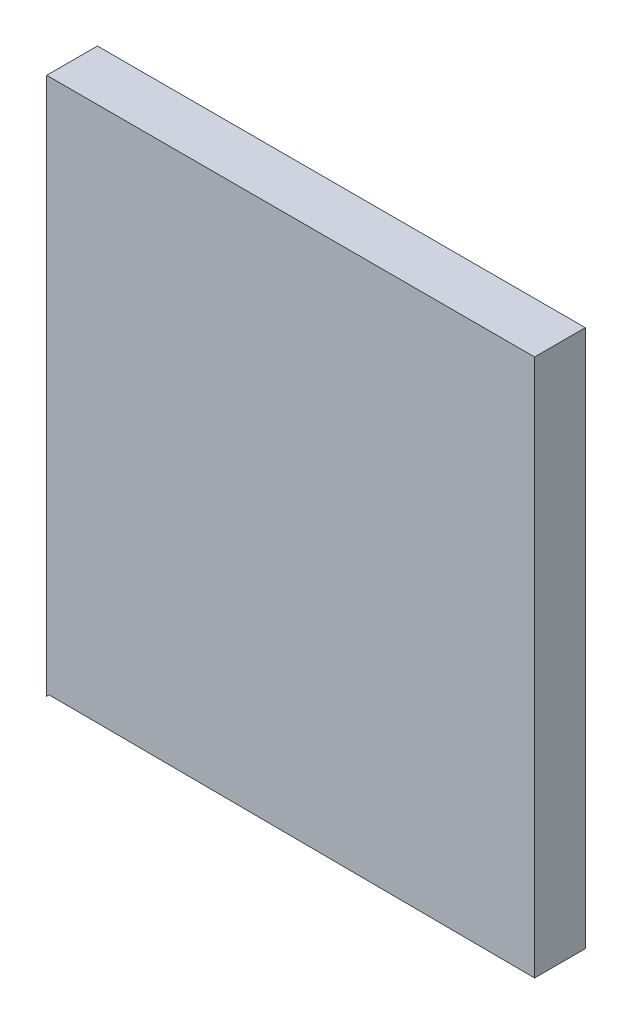
ISO-10303-21;
HEADER;
FILE_DESCRIPTION(('STEP AP214'),'2;1');
FILE_NAME('part.step','',(''),(''),'','','');
FILE_SCHEMA(('AUTOMOTIVE_DESIGN { 1 0 10303 214 1 1 1 1 }'));
ENDSEC;
DATA;
#1=APPLICATION_CONTEXT('core data for automotive mechanical design processes');
#2=APPLICATION_PROTOCOL_DEFINITION('international standard','automotive_design',2000,#1);
#3=PRODUCT_CONTEXT('',#1,'mechanical');
#4=PRODUCT('Part','Part','',(#3));
#5=PRODUCT_RELATED_PRODUCT_CATEGORY('part','',(#4));
#6=PRODUCT_DEFINITION_FORMATION('','',#4);
#7=PRODUCT_DEFINITION_CONTEXT('part definition',#1,'design');
#8=PRODUCT_DEFINITION('design','',#6,#7);
#9=PRODUCT_DEFINITION_SHAPE('','',#8);
#10=(LENGTH_UNIT() NAMED_UNIT(*) SI_UNIT(.MILLI.,.METRE.));
#11=(NAMED_UNIT(*) PLANE_ANGLE_UNIT() SI_UNIT($,.RADIAN.));
#12=(NAMED_UNIT(*) SI_UNIT($,.STERADIAN.) SOLID_ANGLE_UNIT());
#13=UNCERTAINTY_MEASURE_WITH_UNIT(LENGTH_MEASURE(1.E-05),#10,'distance_accuracy_value','');
#14=(GEOMETRIC_REPRESENTATION_CONTEXT(3) GLOBAL_UNCERTAINTY_ASSIGNED_CONTEXT((#13)) GLOBAL_UNIT_ASSIGNED_CONTEXT((#10,
#11,#12)) REPRESENTATION_CONTEXT('',''));
#15=CARTESIAN_POINT('',(0.,0.,0.));
#16=DIRECTION('',(0.,0.,1.));
#17=DIRECTION('',(1.,0.,0.));
#18=AXIS2_PLACEMENT_3D('',#15,#16,#17);
#19=CARTESIAN_POINT('',(12.5000004,0.88900254,0.1999996));
#20=DIRECTION('',(0.,-1.,0.));
#21=DIRECTION('',(-1.,0.,0.));
#22=AXIS2_PLACEMENT_3D('',#19,#20,#21);
#23=PLANE('',#22);
#24=DIRECTION('',(-1.,0.,0.));
#25=VECTOR('',#24,1.);
#26=CARTESIAN_POINT('',(12.5000004,0.88900254,0.1999996));
#27=LINE('',#26,#25);
#28=CARTESIAN_POINT('',(12.5000004,0.88900254,0.1999996));
#29=VERTEX_POINT('',#28);
#30=CARTESIAN_POINT('',(0.,0.88900254,0.1999996));
#31=VERTEX_POINT('',#30);
#32=EDGE_CURVE('E10',#29,#31,#27,.T.);
#33=ORIENTED_EDGE('',*,*,#32,.T.);
#34=DIRECTION('',(0.,0.,1.));
#35=VECTOR('',#34,1.);
#36=CARTESIAN_POINT('',(0.,0.88900254,0.1999996));
#37=LINE('',#36,#35);
#38=CARTESIAN_POINT('',(0.,0.88900254,1.49999954));
#39=VERTEX_POINT('',#38);
#40=EDGE_CURVE('E23',#31,#39,#37,.T.);
#41=ORIENTED_EDGE('',*,*,#40,.T.);
#42=DIRECTION('',(-1.,0.,0.));
#43=VECTOR('',#42,1.);
#44=CARTESIAN_POINT('',(12.5000004,0.88900254,1.49999954));
#45=LINE('',#44,#43);
#46=CARTESIAN_POINT('',(12.5000004,0.88900254,1.49999954));
#47=VERTEX_POINT('',#46);
#48=EDGE_CURVE('E99',#47,#39,#45,.T.);
#49=ORIENTED_EDGE('',*,*,#48,.F.);
#50=DIRECTION('',(0.,0.,1.));
#51=VECTOR('',#50,1.);
#52=CARTESIAN_POINT('',(12.5000004,0.88900254,0.1999996));
#53=LINE('',#52,#51);
#54=EDGE_CURVE('E36',#29,#47,#53,.T.);
#55=ORIENTED_EDGE('',*,*,#54,.F.);
#56=EDGE_LOOP('',(#33,#41,#49,#55));
#57=FACE_BOUND('',#56,.T.);
#58=ADVANCED_FACE('F16',(#57),#23,.F.);
#59=CARTESIAN_POINT('',(0.,0.88900254,0.1999996));
#60=DIRECTION('',(1.,0.,0.));
#61=DIRECTION('',(0.,-1.,0.));
#62=AXIS2_PLACEMENT_3D('',#59,#60,#61);
#63=PLANE('',#62);
#64=DIRECTION('',(0.,-1.,0.));
#65=VECTOR('',#64,1.);
#66=CARTESIAN_POINT('',(0.,0.88900254,0.1999996));
#67=LINE('',#66,#65);
#68=CARTESIAN_POINT('',(0.,-12.89099784,0.1999996));
#69=VERTEX_POINT('',#68);
#70=EDGE_CURVE('E30',#31,#69,#67,.T.);
#71=ORIENTED_EDGE('',*,*,#70,.T.);
#72=DIRECTION('',(0.,0.,1.));
#73=VECTOR('',#72,1.);
#74=CARTESIAN_POINT('',(0.,-12.89099784,0.1999996));
#75=LINE('',#74,#73);
#76=CARTESIAN_POINT('',(0.,-12.89099784,1.49999954));
#77=VERTEX_POINT('',#76);
#78=EDGE_CURVE('E95',#69,#77,#75,.T.);
#79=ORIENTED_EDGE('',*,*,#78,.T.);
#80=DIRECTION('',(0.,-1.,0.));
#81=VECTOR('',#80,1.);
#82=CARTESIAN_POINT('',(0.,0.88900254,1.49999954));
#83=LINE('',#82,#81);
#84=EDGE_CURVE('E93',#39,#77,#83,.T.);
#85=ORIENTED_EDGE('',*,*,#84,.F.);
#86=ORIENTED_EDGE('',*,*,#40,.F.);
#87=EDGE_LOOP('',(#71,#79,#85,#86));
#88=FACE_BOUND('',#87,.T.);
#89=ADVANCED_FACE('F104',(#88),#63,.F.);
#90=CARTESIAN_POINT('',(0.,-12.89099784,0.1999996));
#91=DIRECTION('',(-0.707106781186548,0.707106781186548,0.));
#92=DIRECTION('',(0.707106781186548,0.707106781186548,0.));
#93=AXIS2_PLACEMENT_3D('',#90,#91,#92);
#94=PLANE('',#93);
#95=DIRECTION('',(0.707106781186548,0.707106781186548,0.));
#96=VECTOR('',#95,1.);
#97=CARTESIAN_POINT('',(0.,-12.89099784,0.1999996));
#98=LINE('',#97,#96);
#99=CARTESIAN_POINT('',(0.0640003799999995,-12.82699746,0.1999996));
#100=VERTEX_POINT('',#99);
#101=EDGE_CURVE('E91',#69,#100,#98,.T.);
#102=ORIENTED_EDGE('',*,*,#101,.T.);
#103=DIRECTION('',(0.,0.,1.));
#104=VECTOR('',#103,1.);
#105=CARTESIAN_POINT('',(0.0640003799999995,-12.82699746,0.1999996));
#106=LINE('',#105,#104);
#107=CARTESIAN_POINT('',(0.0640003799999995,-12.82699746,1.49999954));
#108=VERTEX_POINT('',#107);
#109=EDGE_CURVE('E89',#100,#108,#106,.T.);
#110=ORIENTED_EDGE('',*,*,#109,.T.);
#111=DIRECTION('',(0.707106781186548,0.707106781186548,0.));
#112=VECTOR('',#111,1.);
#113=CARTESIAN_POINT('',(0.,-12.89099784,1.49999954));
#114=LINE('',#113,#112);
#115=EDGE_CURVE('E68',#77,#108,#114,.T.);
#116=ORIENTED_EDGE('',*,*,#115,.F.);
#117=ORIENTED_EDGE('',*,*,#78,.F.);
#118=EDGE_LOOP('',(#102,#110,#116,#117));
#119=FACE_BOUND('',#118,.T.);
#120=ADVANCED_FACE('F107',(#119),#94,.F.);
#121=CARTESIAN_POINT('',(0.0640003799999995,-12.82699746,0.1999996));
#122=DIRECTION('',(0.005146311706471,0.99998675765023,0.));
#123=DIRECTION('',(0.99998675765023,-0.005146311706471,0.));
#124=AXIS2_PLACEMENT_3D('',#121,#122,#123);
#125=PLANE('',#124);
#126=DIRECTION('',(0.99998675765023,-0.005146311706471,0.));
#127=VECTOR('',#126,1.);
#128=CARTESIAN_POINT('',(0.0640003799999995,-12.82699746,0.1999996));
#129=LINE('',#128,#127);
#130=CARTESIAN_POINT('',(12.5000004,-12.89099784,0.1999996));
#131=VERTEX_POINT('',#130);
#132=EDGE_CURVE('E78',#100,#131,#129,.T.);
#133=ORIENTED_EDGE('',*,*,#132,.T.);
#134=DIRECTION('',(0.,0.,1.));
#135=VECTOR('',#134,1.);
#136=CARTESIAN_POINT('',(12.5000004,-12.89099784,0.1999996));
#137=LINE('',#136,#135);
#138=CARTESIAN_POINT('',(12.5000004,-12.89099784,1.49999954));
#139=VERTEX_POINT('',#138);
#140=EDGE_CURVE('E72',#131,#139,#137,.T.);
#141=ORIENTED_EDGE('',*,*,#140,.T.);
#142=DIRECTION('',(0.99998675765023,-0.005146311706471,0.));
#143=VECTOR('',#142,1.);
#144=CARTESIAN_POINT('',(0.0640003799999995,-12.82699746,1.49999954));
#145=LINE('',#144,#143);
#146=EDGE_CURVE('E61',#108,#139,#145,.T.);
#147=ORIENTED_EDGE('',*,*,#146,.F.);
#148=ORIENTED_EDGE('',*,*,#109,.F.);
#149=EDGE_LOOP('',(#133,#141,#147,#148));
#150=FACE_BOUND('',#149,.T.);
#151=ADVANCED_FACE('F76',(#150),#125,.F.);
#152=CARTESIAN_POINT('',(12.5000004,-12.89099784,0.1999996));
#153=DIRECTION('',(-1.,0.,0.));
#154=DIRECTION('',(0.,1.,0.));
#155=AXIS2_PLACEMENT_3D('',#152,#153,#154);
#156=PLANE('',#155);
#157=DIRECTION('',(0.,1.,0.));
#158=VECTOR('',#157,1.);
#159=CARTESIAN_POINT('',(12.5000004,-12.89099784,0.1999996));
#160=LINE('',#159,#158);
#161=EDGE_CURVE('E73',#131,#29,#160,.T.);
#162=ORIENTED_EDGE('',*,*,#161,.T.);
#163=ORIENTED_EDGE('',*,*,#54,.T.);
#164=DIRECTION('',(0.,1.,0.));
#165=VECTOR('',#164,1.);
#166=CARTESIAN_POINT('',(12.5000004,-12.89099784,1.49999954));
#167=LINE('',#166,#165);
#168=EDGE_CURVE('E65',#139,#47,#167,.T.);
#169=ORIENTED_EDGE('',*,*,#168,.F.);
#170=ORIENTED_EDGE('',*,*,#140,.F.);
#171=EDGE_LOOP('',(#162,#163,#169,#170));
#172=FACE_BOUND('',#171,.T.);
#173=ADVANCED_FACE('F83',(#172),#156,.F.);
#174=CARTESIAN_POINT('',(6.24686570212,-5.996869824887,0.1999996));
#175=DIRECTION('',(0.,0.,1.));
#176=DIRECTION('',(0.,1.,0.));
#177=AXIS2_PLACEMENT_3D('',#174,#175,#176);
#178=PLANE('',#177);
#179=ORIENTED_EDGE('',*,*,#161,.F.);
#180=ORIENTED_EDGE('',*,*,#132,.F.);
#181=ORIENTED_EDGE('',*,*,#101,.F.);
#182=ORIENTED_EDGE('',*,*,#70,.F.);
#183=ORIENTED_EDGE('',*,*,#32,.F.);
#184=EDGE_LOOP('',(#179,#180,#181,#182,#183));
#185=FACE_BOUND('',#184,.T.);
#186=ADVANCED_FACE('F108',(#185),#178,.F.);
#187=CARTESIAN_POINT('',(6.24686570212,-5.996869824887,1.49999954));
#188=DIRECTION('',(0.,0.,1.));
#189=DIRECTION('',(0.,1.,0.));
#190=AXIS2_PLACEMENT_3D('',#187,#188,#189);
#191=PLANE('',#190);
#192=ORIENTED_EDGE('',*,*,#48,.T.);
#193=ORIENTED_EDGE('',*,*,#84,.T.);
#194=ORIENTED_EDGE('',*,*,#115,.T.);
#195=ORIENTED_EDGE('',*,*,#146,.T.);
#196=ORIENTED_EDGE('',*,*,#168,.T.);
#197=EDGE_LOOP('',(#192,#193,#194,#195,#196));
#198=FACE_BOUND('',#197,.T.);
#199=ADVANCED_FACE('F63',(#198),#191,.T.);
#200=CLOSED_SHELL('',(#58,#89,#120,#151,#173,#186,#199));
#201=MANIFOLD_SOLID_BREP('B1',#200);
#202=ADVANCED_BREP_SHAPE_REPRESENTATION('',(#18,#201),#14);
#203=SHAPE_DEFINITION_REPRESENTATION(#9,#202);
ENDSEC;
END-ISO-10303-21;
